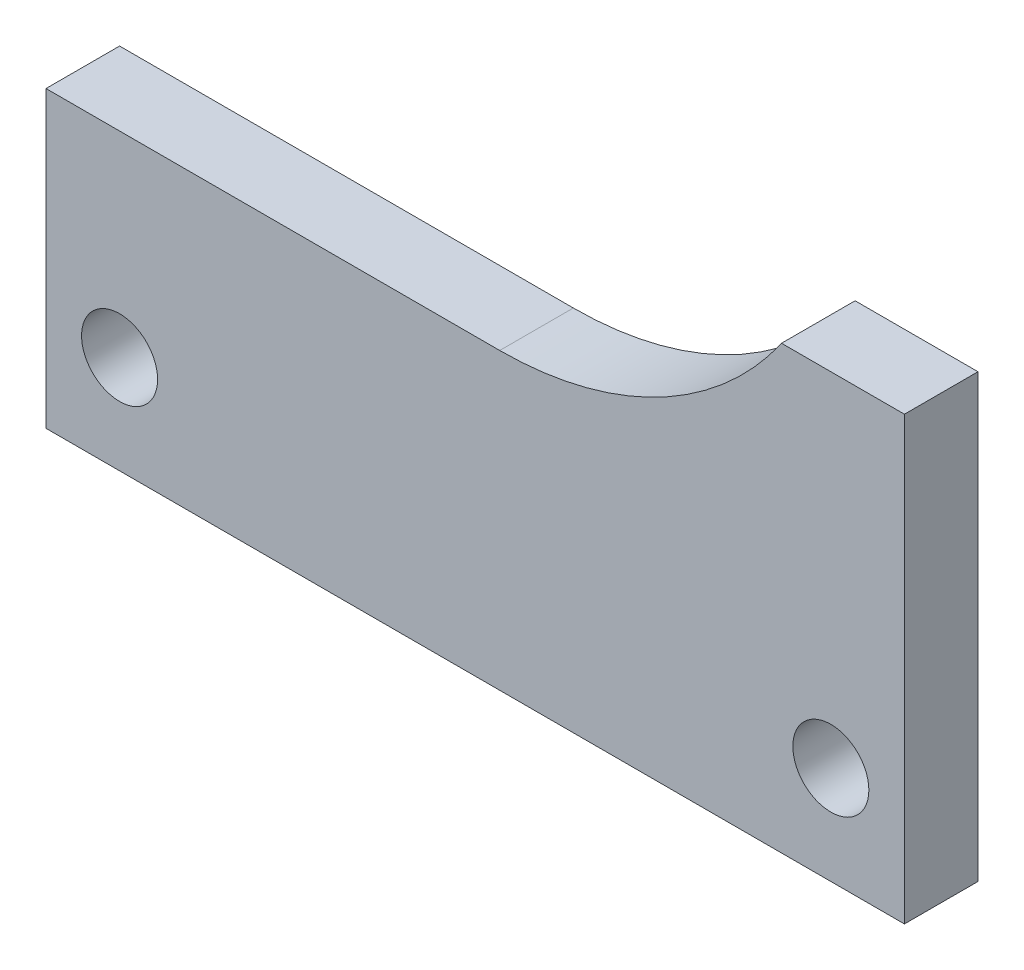
ISO-10303-21;
HEADER;
FILE_DESCRIPTION(('STEP AP214'),'2;1');
FILE_NAME('part.step','',(''),(''),'','','');
FILE_SCHEMA(('AUTOMOTIVE_DESIGN { 1 0 10303 214 1 1 1 1 }'));
ENDSEC;
DATA;
#1=APPLICATION_CONTEXT('core data for automotive mechanical design processes');
#2=APPLICATION_PROTOCOL_DEFINITION('international standard','automotive_design',2000,#1);
#3=PRODUCT_CONTEXT('',#1,'mechanical');
#4=PRODUCT('Part','Part','',(#3));
#5=PRODUCT_RELATED_PRODUCT_CATEGORY('part','',(#4));
#6=PRODUCT_DEFINITION_FORMATION('','',#4);
#7=PRODUCT_DEFINITION_CONTEXT('part definition',#1,'design');
#8=PRODUCT_DEFINITION('design','',#6,#7);
#9=PRODUCT_DEFINITION_SHAPE('','',#8);
#10=(LENGTH_UNIT() NAMED_UNIT(*) SI_UNIT(.MILLI.,.METRE.));
#11=(NAMED_UNIT(*) PLANE_ANGLE_UNIT() SI_UNIT($,.RADIAN.));
#12=(NAMED_UNIT(*) SI_UNIT($,.STERADIAN.) SOLID_ANGLE_UNIT());
#13=UNCERTAINTY_MEASURE_WITH_UNIT(LENGTH_MEASURE(1.E-05),#10,'distance_accuracy_value','');
#14=(GEOMETRIC_REPRESENTATION_CONTEXT(3) GLOBAL_UNCERTAINTY_ASSIGNED_CONTEXT((#13)) GLOBAL_UNIT_ASSIGNED_CONTEXT((#10,
#11,#12)) REPRESENTATION_CONTEXT('',''));
#15=CARTESIAN_POINT('',(0.,0.,0.));
#16=DIRECTION('',(0.,0.,1.));
#17=DIRECTION('',(1.,0.,0.));
#18=AXIS2_PLACEMENT_3D('',#15,#16,#17);
#19=CARTESIAN_POINT('',(33.5738435599158,16.8876764015411,3.));
#20=DIRECTION('',(0.,0.,1.));
#21=DIRECTION('',(1.,0.,0.));
#22=AXIS2_PLACEMENT_3D('',#19,#20,#21);
#23=PLANE('',#22);
#24=CARTESIAN_POINT('',(18.0738435599158,-5.11232359845895,3.));
#25=DIRECTION('',(0.,0.,1.));
#26=DIRECTION('',(1.,0.,0.));
#27=AXIS2_PLACEMENT_3D('',#24,#25,#26);
#28=CIRCLE('',#27,1.55);
#29=CARTESIAN_POINT('',(19.6238435599158,-5.11232359845895,3.));
#30=VERTEX_POINT('',#29);
#31=EDGE_CURVE('E120',#30,#30,#28,.T.);
#32=ORIENTED_EDGE('',*,*,#31,.F.);
#33=EDGE_LOOP('',(#32));
#34=FACE_BOUND('',#33,.T.);
#35=DIRECTION('',(0.,-1.,0.));
#36=VECTOR('',#35,1.);
#37=CARTESIAN_POINT('',(15.0738435599158,0.887676438735543,3.));
#38=LINE('',#37,#36);
#39=CARTESIAN_POINT('',(15.0738435599158,2.88767640154106,3.));
#40=VERTEX_POINT('',#39);
#41=CARTESIAN_POINT('',(15.0738435599158,-9.11232359845895,3.));
#42=VERTEX_POINT('',#41);
#43=EDGE_CURVE('E50',#40,#42,#38,.T.);
#44=ORIENTED_EDGE('',*,*,#43,.T.);
#45=DIRECTION('',(1.,0.,0.));
#46=VECTOR('',#45,1.);
#47=CARTESIAN_POINT('',(15.0738435599158,-9.11232359845895,3.));
#48=LINE('',#47,#46);
#49=CARTESIAN_POINT('',(50.0738435599158,-9.11232359845895,3.));
#50=VERTEX_POINT('',#49);
#51=EDGE_CURVE('E143',#42,#50,#48,.T.);
#52=ORIENTED_EDGE('',*,*,#51,.T.);
#53=DIRECTION('',(0.,1.,0.));
#54=VECTOR('',#53,1.);
#55=CARTESIAN_POINT('',(50.0738435599158,-9.11232359845895,3.));
#56=LINE('',#55,#54);
#57=CARTESIAN_POINT('',(50.0738435599158,8.88767640154105,3.));
#58=VERTEX_POINT('',#57);
#59=EDGE_CURVE('E98',#50,#58,#56,.T.);
#60=ORIENTED_EDGE('',*,*,#59,.T.);
#61=DIRECTION('',(-1.,0.,0.));
#62=VECTOR('',#61,1.);
#63=CARTESIAN_POINT('',(50.0738435599158,8.88767640154105,3.));
#64=LINE('',#63,#62);
#65=CARTESIAN_POINT('',(45.0629688529918,8.88767640154105,3.));
#66=VERTEX_POINT('',#65);
#67=EDGE_CURVE('E92',#58,#66,#64,.T.);
#68=ORIENTED_EDGE('',*,*,#67,.T.);
#69=CARTESIAN_POINT('',(33.5738435599158,16.8876764015411,3.));
#70=DIRECTION('',(0.,0.,-1.));
#71=DIRECTION('',(1.,0.,0.));
#72=AXIS2_PLACEMENT_3D('',#69,#70,#71);
#73=CIRCLE('',#72,14.);
#74=CARTESIAN_POINT('',(33.5738435599158,2.88767640154106,3.));
#75=VERTEX_POINT('',#74);
#76=EDGE_CURVE('E96',#66,#75,#73,.T.);
#77=ORIENTED_EDGE('',*,*,#76,.T.);
#78=DIRECTION('',(-1.,0.,0.));
#79=VECTOR('',#78,1.);
#80=CARTESIAN_POINT('',(33.5738435599158,2.88767640154106,3.));
#81=LINE('',#80,#79);
#82=EDGE_CURVE('E111',#75,#40,#81,.T.);
#83=ORIENTED_EDGE('',*,*,#82,.T.);
#84=EDGE_LOOP('',(#44,#52,#60,#68,#77,#83));
#85=FACE_BOUND('',#84,.T.);
#86=CARTESIAN_POINT('',(47.0738435599158,-5.11232359845895,3.));
#87=DIRECTION('',(0.,0.,1.));
#88=DIRECTION('',(1.,0.,0.));
#89=AXIS2_PLACEMENT_3D('',#86,#87,#88);
#90=CIRCLE('',#89,1.55);
#91=CARTESIAN_POINT('',(48.6238435599158,-5.11232359845895,3.));
#92=VERTEX_POINT('',#91);
#93=EDGE_CURVE('E150',#92,#92,#90,.T.);
#94=ORIENTED_EDGE('',*,*,#93,.F.);
#95=EDGE_LOOP('',(#94));
#96=FACE_BOUND('',#95,.T.);
#97=ADVANCED_FACE('F33',(#34,#85,#96),#23,.T.);
#98=CARTESIAN_POINT('',(33.5738435599158,16.8876764015411,0.));
#99=DIRECTION('',(0.,0.,1.));
#100=DIRECTION('',(1.,0.,0.));
#101=AXIS2_PLACEMENT_3D('',#98,#99,#100);
#102=PLANE('',#101);
#103=CARTESIAN_POINT('',(18.0738435599158,-5.11232359845895,0.));
#104=DIRECTION('',(0.,0.,1.));
#105=DIRECTION('',(1.,0.,0.));
#106=AXIS2_PLACEMENT_3D('',#103,#104,#105);
#107=CIRCLE('',#106,1.55);
#108=CARTESIAN_POINT('',(19.6238435599158,-5.11232359845895,0.));
#109=VERTEX_POINT('',#108);
#110=EDGE_CURVE('E147',#109,#109,#107,.T.);
#111=ORIENTED_EDGE('',*,*,#110,.T.);
#112=EDGE_LOOP('',(#111));
#113=FACE_BOUND('',#112,.T.);
#114=DIRECTION('',(1.,0.,0.));
#115=VECTOR('',#114,1.);
#116=CARTESIAN_POINT('',(15.0738435599158,-9.11232359845895,0.));
#117=LINE('',#116,#115);
#118=CARTESIAN_POINT('',(15.0738435599158,-9.11232359845895,0.));
#119=VERTEX_POINT('',#118);
#120=CARTESIAN_POINT('',(50.0738435599158,-9.11232359845895,0.));
#121=VERTEX_POINT('',#120);
#122=EDGE_CURVE('E117',#119,#121,#117,.T.);
#123=ORIENTED_EDGE('',*,*,#122,.F.);
#124=DIRECTION('',(0.,-1.,0.));
#125=VECTOR('',#124,1.);
#126=CARTESIAN_POINT('',(15.0738435599158,2.88767640154106,0.));
#127=LINE('',#126,#125);
#128=CARTESIAN_POINT('',(15.0738435599158,2.88767640154106,0.));
#129=VERTEX_POINT('',#128);
#130=EDGE_CURVE('E126',#129,#119,#127,.T.);
#131=ORIENTED_EDGE('',*,*,#130,.F.);
#132=DIRECTION('',(-1.,0.,0.));
#133=VECTOR('',#132,1.);
#134=CARTESIAN_POINT('',(33.5738435599158,2.88767640154106,0.));
#135=LINE('',#134,#133);
#136=CARTESIAN_POINT('',(33.5738435599158,2.88767640154106,0.));
#137=VERTEX_POINT('',#136);
#138=EDGE_CURVE('E81',#137,#129,#135,.T.);
#139=ORIENTED_EDGE('',*,*,#138,.F.);
#140=CARTESIAN_POINT('',(33.5738435599158,16.8876764015411,0.));
#141=DIRECTION('',(0.,0.,-1.));
#142=DIRECTION('',(1.,0.,0.));
#143=AXIS2_PLACEMENT_3D('',#140,#141,#142);
#144=CIRCLE('',#143,14.);
#145=CARTESIAN_POINT('',(45.0629688529918,8.88767640154105,0.));
#146=VERTEX_POINT('',#145);
#147=EDGE_CURVE('E74',#146,#137,#144,.T.);
#148=ORIENTED_EDGE('',*,*,#147,.F.);
#149=DIRECTION('',(-1.,0.,0.));
#150=VECTOR('',#149,1.);
#151=CARTESIAN_POINT('',(46.5738435599158,8.88767640154105,0.));
#152=LINE('',#151,#150);
#153=CARTESIAN_POINT('',(50.0738435599158,8.88767640154105,0.));
#154=VERTEX_POINT('',#153);
#155=EDGE_CURVE('E105',#154,#146,#152,.T.);
#156=ORIENTED_EDGE('',*,*,#155,.F.);
#157=DIRECTION('',(0.,1.,0.));
#158=VECTOR('',#157,1.);
#159=CARTESIAN_POINT('',(50.0738435599158,-9.11232359845895,0.));
#160=LINE('',#159,#158);
#161=EDGE_CURVE('E119',#121,#154,#160,.T.);
#162=ORIENTED_EDGE('',*,*,#161,.F.);
#163=EDGE_LOOP('',(#123,#131,#139,#148,#156,#162));
#164=FACE_BOUND('',#163,.T.);
#165=CARTESIAN_POINT('',(47.0738435599158,-5.11232359845895,0.));
#166=DIRECTION('',(0.,0.,1.));
#167=DIRECTION('',(1.,0.,0.));
#168=AXIS2_PLACEMENT_3D('',#165,#166,#167);
#169=CIRCLE('',#168,1.55);
#170=CARTESIAN_POINT('',(48.6238435599158,-5.11232359845895,0.));
#171=VERTEX_POINT('',#170);
#172=EDGE_CURVE('E153',#171,#171,#169,.T.);
#173=ORIENTED_EDGE('',*,*,#172,.T.);
#174=EDGE_LOOP('',(#173));
#175=FACE_BOUND('',#174,.T.);
#176=ADVANCED_FACE('F139',(#113,#164,#175),#102,.F.);
#177=CARTESIAN_POINT('',(15.0738435599158,-9.11232359845895,3.));
#178=DIRECTION('',(0.,1.,0.));
#179=DIRECTION('',(0.,0.,1.));
#180=AXIS2_PLACEMENT_3D('',#177,#178,#179);
#181=PLANE('',#180);
#182=ORIENTED_EDGE('',*,*,#122,.T.);
#183=DIRECTION('',(0.,0.,-1.));
#184=VECTOR('',#183,1.);
#185=CARTESIAN_POINT('',(50.0738435599158,-9.11232359845895,3.));
#186=LINE('',#185,#184);
#187=EDGE_CURVE('E42',#50,#121,#186,.T.);
#188=ORIENTED_EDGE('',*,*,#187,.F.);
#189=ORIENTED_EDGE('',*,*,#51,.F.);
#190=DIRECTION('',(0.,0.,-1.));
#191=VECTOR('',#190,1.);
#192=CARTESIAN_POINT('',(15.0738435599158,-9.11232359845895,3.));
#193=LINE('',#192,#191);
#194=EDGE_CURVE('E11',#42,#119,#193,.T.);
#195=ORIENTED_EDGE('',*,*,#194,.T.);
#196=EDGE_LOOP('',(#182,#188,#189,#195));
#197=FACE_BOUND('',#196,.T.);
#198=ADVANCED_FACE('F35',(#197),#181,.F.);
#199=CARTESIAN_POINT('',(50.0738435599158,-9.11232359845895,3.));
#200=DIRECTION('',(-1.,0.,0.));
#201=DIRECTION('',(0.,0.,1.));
#202=AXIS2_PLACEMENT_3D('',#199,#200,#201);
#203=PLANE('',#202);
#204=ORIENTED_EDGE('',*,*,#161,.T.);
#205=DIRECTION('',(0.,0.,-1.));
#206=VECTOR('',#205,1.);
#207=CARTESIAN_POINT('',(50.0738435599158,8.88767640154105,3.));
#208=LINE('',#207,#206);
#209=EDGE_CURVE('E106',#58,#154,#208,.T.);
#210=ORIENTED_EDGE('',*,*,#209,.F.);
#211=ORIENTED_EDGE('',*,*,#59,.F.);
#212=ORIENTED_EDGE('',*,*,#187,.T.);
#213=EDGE_LOOP('',(#204,#210,#211,#212));
#214=FACE_BOUND('',#213,.T.);
#215=ADVANCED_FACE('F134',(#214),#203,.F.);
#216=CARTESIAN_POINT('',(46.5738435599158,8.88767640154105,3.));
#217=DIRECTION('',(0.,-1.,0.));
#218=DIRECTION('',(1.,0.,0.));
#219=AXIS2_PLACEMENT_3D('',#216,#217,#218);
#220=PLANE('',#219);
#221=ORIENTED_EDGE('',*,*,#155,.T.);
#222=DIRECTION('',(0.,0.,-1.));
#223=VECTOR('',#222,1.);
#224=CARTESIAN_POINT('',(45.0629688529918,8.88767640154105,3.));
#225=LINE('',#224,#223);
#226=EDGE_CURVE('E103',#66,#146,#225,.T.);
#227=ORIENTED_EDGE('',*,*,#226,.F.);
#228=ORIENTED_EDGE('',*,*,#67,.F.);
#229=ORIENTED_EDGE('',*,*,#209,.T.);
#230=EDGE_LOOP('',(#221,#227,#228,#229));
#231=FACE_BOUND('',#230,.T.);
#232=ADVANCED_FACE('F104',(#231),#220,.F.);
#233=CARTESIAN_POINT('',(33.5738435599158,16.8876764015411,3.));
#234=DIRECTION('',(0.,0.,-1.));
#235=DIRECTION('',(-1.,0.,0.));
#236=AXIS2_PLACEMENT_3D('',#233,#234,#235);
#237=CYLINDRICAL_SURFACE('',#236,14.);
#238=ORIENTED_EDGE('',*,*,#147,.T.);
#239=DIRECTION('',(0.,0.,-1.));
#240=VECTOR('',#239,1.);
#241=CARTESIAN_POINT('',(33.5738435599158,2.88767640154106,3.));
#242=LINE('',#241,#240);
#243=EDGE_CURVE('E107',#75,#137,#242,.T.);
#244=ORIENTED_EDGE('',*,*,#243,.F.);
#245=ORIENTED_EDGE('',*,*,#76,.F.);
#246=ORIENTED_EDGE('',*,*,#226,.T.);
#247=EDGE_LOOP('',(#238,#244,#245,#246));
#248=FACE_BOUND('',#247,.T.);
#249=ADVANCED_FACE('F109',(#248),#237,.F.);
#250=CARTESIAN_POINT('',(33.5738435599158,2.88767640154106,3.));
#251=DIRECTION('',(0.,-1.,0.));
#252=DIRECTION('',(0.,0.,-1.));
#253=AXIS2_PLACEMENT_3D('',#250,#251,#252);
#254=PLANE('',#253);
#255=ORIENTED_EDGE('',*,*,#138,.T.);
#256=DIRECTION('',(0.,0.,-1.));
#257=VECTOR('',#256,1.);
#258=CARTESIAN_POINT('',(15.0738435599158,2.88767640154106,3.));
#259=LINE('',#258,#257);
#260=EDGE_CURVE('E113',#40,#129,#259,.T.);
#261=ORIENTED_EDGE('',*,*,#260,.F.);
#262=ORIENTED_EDGE('',*,*,#82,.F.);
#263=ORIENTED_EDGE('',*,*,#243,.T.);
#264=EDGE_LOOP('',(#255,#261,#262,#263));
#265=FACE_BOUND('',#264,.T.);
#266=ADVANCED_FACE('F176',(#265),#254,.F.);
#267=CARTESIAN_POINT('',(15.0738435599158,2.88767640154106,3.));
#268=DIRECTION('',(1.,0.,0.));
#269=DIRECTION('',(0.,1.,0.));
#270=AXIS2_PLACEMENT_3D('',#267,#268,#269);
#271=PLANE('',#270);
#272=ORIENTED_EDGE('',*,*,#130,.T.);
#273=ORIENTED_EDGE('',*,*,#194,.F.);
#274=ORIENTED_EDGE('',*,*,#43,.F.);
#275=ORIENTED_EDGE('',*,*,#260,.T.);
#276=EDGE_LOOP('',(#272,#273,#274,#275));
#277=FACE_BOUND('',#276,.T.);
#278=ADVANCED_FACE('F142',(#277),#271,.F.);
#279=CARTESIAN_POINT('',(18.0738435599158,-5.11232359845895,3.));
#280=DIRECTION('',(0.,0.,-1.));
#281=DIRECTION('',(-1.,0.,0.));
#282=AXIS2_PLACEMENT_3D('',#279,#280,#281);
#283=CYLINDRICAL_SURFACE('',#282,1.55);
#284=ORIENTED_EDGE('',*,*,#31,.T.);
#285=EDGE_LOOP('',(#284));
#286=FACE_BOUND('',#285,.T.);
#287=ORIENTED_EDGE('',*,*,#110,.F.);
#288=EDGE_LOOP('',(#287));
#289=FACE_BOUND('',#288,.T.);
#290=ADVANCED_FACE('F171',(#286,#289),#283,.F.);
#291=CARTESIAN_POINT('',(47.0738435599158,-5.11232359845895,3.));
#292=DIRECTION('',(0.,0.,-1.));
#293=DIRECTION('',(-1.,0.,0.));
#294=AXIS2_PLACEMENT_3D('',#291,#292,#293);
#295=CYLINDRICAL_SURFACE('',#294,1.55);
#296=ORIENTED_EDGE('',*,*,#93,.T.);
#297=EDGE_LOOP('',(#296));
#298=FACE_BOUND('',#297,.T.);
#299=ORIENTED_EDGE('',*,*,#172,.F.);
#300=EDGE_LOOP('',(#299));
#301=FACE_BOUND('',#300,.T.);
#302=ADVANCED_FACE('F159',(#298,#301),#295,.F.);
#303=CLOSED_SHELL('',(#97,#176,#198,#215,#232,#249,#266,#278,#290,#302));
#304=MANIFOLD_SOLID_BREP('B2',#303);
#305=ADVANCED_BREP_SHAPE_REPRESENTATION('',(#18,#304),#14);
#306=SHAPE_DEFINITION_REPRESENTATION(#9,#305);
ENDSEC;
END-ISO-10303-21;
